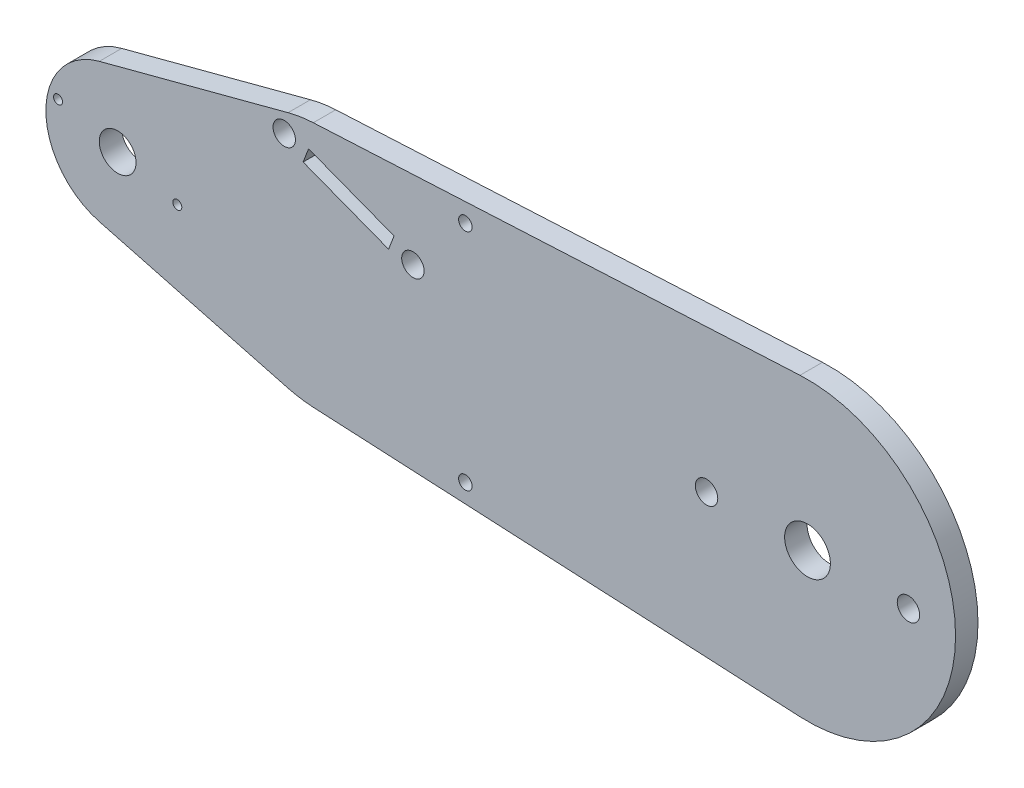
ISO-10303-21;
HEADER;
FILE_DESCRIPTION(('STEP AP214'),'2;1');
FILE_NAME('part.step','',(''),(''),'','','');
FILE_SCHEMA(('AUTOMOTIVE_DESIGN { 1 0 10303 214 1 1 1 1 }'));
ENDSEC;
DATA;
#1=APPLICATION_CONTEXT('core data for automotive mechanical design processes');
#2=APPLICATION_PROTOCOL_DEFINITION('international standard','automotive_design',2000,#1);
#3=PRODUCT_CONTEXT('',#1,'mechanical');
#4=PRODUCT('Part','Part','',(#3));
#5=PRODUCT_RELATED_PRODUCT_CATEGORY('part','',(#4));
#6=PRODUCT_DEFINITION_FORMATION('','',#4);
#7=PRODUCT_DEFINITION_CONTEXT('part definition',#1,'design');
#8=PRODUCT_DEFINITION('design','',#6,#7);
#9=PRODUCT_DEFINITION_SHAPE('','',#8);
#10=(LENGTH_UNIT() NAMED_UNIT(*) SI_UNIT(.MILLI.,.METRE.));
#11=(NAMED_UNIT(*) PLANE_ANGLE_UNIT() SI_UNIT($,.RADIAN.));
#12=(NAMED_UNIT(*) SI_UNIT($,.STERADIAN.) SOLID_ANGLE_UNIT());
#13=UNCERTAINTY_MEASURE_WITH_UNIT(LENGTH_MEASURE(1.E-05),#10,'distance_accuracy_value','');
#14=(GEOMETRIC_REPRESENTATION_CONTEXT(3) GLOBAL_UNCERTAINTY_ASSIGNED_CONTEXT((#13)) GLOBAL_UNIT_ASSIGNED_CONTEXT((#10,
#11,#12)) REPRESENTATION_CONTEXT('',''));
#15=CARTESIAN_POINT('',(0.,0.,0.));
#16=DIRECTION('',(0.,0.,1.));
#17=DIRECTION('',(1.,0.,0.));
#18=AXIS2_PLACEMENT_3D('',#15,#16,#17);
#19=CARTESIAN_POINT('',(0.,0.,5.));
#20=DIRECTION('',(0.,0.,1.));
#21=DIRECTION('',(1.,0.,0.));
#22=AXIS2_PLACEMENT_3D('',#19,#20,#21);
#23=PLANE('',#22);
#24=CARTESIAN_POINT('',(-88.5815773829106,-3.51388888888885,5.));
#25=DIRECTION('',(0.,0.,1.));
#26=DIRECTION('',(1.,0.,0.));
#27=AXIS2_PLACEMENT_3D('',#24,#25,#26);
#28=CIRCLE('',#27,0.999999999999998);
#29=CARTESIAN_POINT('',(-87.5815773829106,-3.51388888888885,5.));
#30=VERTEX_POINT('',#29);
#31=EDGE_CURVE('E265',#30,#30,#28,.T.);
#32=ORIENTED_EDGE('',*,*,#31,.F.);
#33=EDGE_LOOP('',(#32));
#34=FACE_BOUND('',#33,.T.);
#35=CARTESIAN_POINT('',(-115.168422617089,3.51388888888893,5.));
#36=DIRECTION('',(0.,0.,1.));
#37=DIRECTION('',(-1.,0.,0.));
#38=AXIS2_PLACEMENT_3D('',#35,#36,#37);
#39=CIRCLE('',#38,0.999999999999998);
#40=CARTESIAN_POINT('',(-116.168422617089,3.51388888888893,5.));
#41=VERTEX_POINT('',#40);
#42=EDGE_CURVE('E269',#41,#41,#39,.T.);
#43=ORIENTED_EDGE('',*,*,#42,.F.);
#44=EDGE_LOOP('',(#43));
#45=FACE_BOUND('',#44,.T.);
#46=DIRECTION('',(-0.358042046673402,-0.933705463630754,0.));
#47=VECTOR('',#46,1.);
#48=CARTESIAN_POINT('',(-59.0423704408644,22.6405991787751,5.));
#49=LINE('',#48,#47);
#50=CARTESIAN_POINT('',(-59.3204932961019,21.9153077446862,5.));
#51=VERTEX_POINT('',#50);
#52=CARTESIAN_POINT('',(-60.5378362547915,18.7407091683417,5.));
#53=VERTEX_POINT('',#52);
#54=EDGE_CURVE('E135',#51,#53,#49,.T.);
#55=ORIENTED_EDGE('',*,*,#54,.F.);
#56=DIRECTION('',(-0.933705463630753,0.358042046673404,0.));
#57=VECTOR('',#56,1.);
#58=CARTESIAN_POINT('',(-0.278122855237568,-0.725291434088967,5.));
#59=LINE('',#58,#57);
#60=CARTESIAN_POINT('',(-40.2729018380345,14.6112499925488,5.));
#61=VERTEX_POINT('',#60);
#62=EDGE_CURVE('E174',#61,#51,#59,.T.);
#63=ORIENTED_EDGE('',*,*,#62,.F.);
#64=DIRECTION('',(0.358042046673404,0.933705463630753,0.));
#65=VECTOR('',#64,1.);
#66=CARTESIAN_POINT('',(-39.994778982797,15.3365414266378,5.));
#67=LINE('',#66,#65);
#68=CARTESIAN_POINT('',(-41.4902447967241,11.4366514162042,5.));
#69=VERTEX_POINT('',#68);
#70=EDGE_CURVE('E172',#69,#61,#67,.T.);
#71=ORIENTED_EDGE('',*,*,#70,.F.);
#72=DIRECTION('',(0.933705463630753,-0.358042046673404,0.));
#73=VECTOR('',#72,1.);
#74=CARTESIAN_POINT('',(-1.49546581392714,-3.89989001043353,5.));
#75=LINE('',#74,#73);
#76=EDGE_CURVE('E170',#53,#69,#75,.T.);
#77=ORIENTED_EDGE('',*,*,#76,.F.);
#78=EDGE_LOOP('',(#55,#63,#71,#77));
#79=FACE_BOUND('',#78,.T.);
#80=CARTESIAN_POINT('',(-64.7424236827205,22.1737179842573,5.));
#81=DIRECTION('',(0.,0.,1.));
#82=DIRECTION('',(1.,0.,0.));
#83=AXIS2_PLACEMENT_3D('',#80,#81,#82);
#84=CIRCLE('',#83,2.5);
#85=CARTESIAN_POINT('',(-62.2424236827205,22.1737179842573,5.));
#86=VERTEX_POINT('',#85);
#87=EDGE_CURVE('E163',#86,#86,#84,.T.);
#88=ORIENTED_EDGE('',*,*,#87,.F.);
#89=EDGE_LOOP('',(#88));
#90=FACE_BOUND('',#89,.T.);
#91=CARTESIAN_POINT('',(-36.0683144101055,11.1782411766331,5.));
#92=DIRECTION('',(0.,0.,1.));
#93=DIRECTION('',(1.,0.,0.));
#94=AXIS2_PLACEMENT_3D('',#91,#92,#93);
#95=CIRCLE('',#94,2.5);
#96=CARTESIAN_POINT('',(-33.5683144101055,11.1782411766331,5.));
#97=VERTEX_POINT('',#96);
#98=EDGE_CURVE('E166',#97,#97,#95,.T.);
#99=ORIENTED_EDGE('',*,*,#98,.F.);
#100=EDGE_LOOP('',(#99));
#101=FACE_BOUND('',#100,.T.);
#102=CARTESIAN_POINT('',(-24.375,-25.,5.));
#103=DIRECTION('',(0.,0.,-1.));
#104=DIRECTION('',(1.,0.,0.));
#105=AXIS2_PLACEMENT_3D('',#102,#103,#104);
#106=CIRCLE('',#105,1.5);
#107=CARTESIAN_POINT('',(-22.875,-25.,5.));
#108=VERTEX_POINT('',#107);
#109=EDGE_CURVE('E177',#108,#108,#106,.T.);
#110=ORIENTED_EDGE('',*,*,#109,.T.);
#111=EDGE_LOOP('',(#110));
#112=FACE_BOUND('',#111,.T.);
#113=CARTESIAN_POINT('',(-101.875,0.,5.));
#114=DIRECTION('',(0.,0.,1.));
#115=DIRECTION('',(1.,0.,0.));
#116=AXIS2_PLACEMENT_3D('',#113,#114,#115);
#117=CIRCLE('',#116,4.09999999999999);
#118=CARTESIAN_POINT('',(-97.775,0.,5.));
#119=VERTEX_POINT('',#118);
#120=EDGE_CURVE('E213',#119,#119,#117,.T.);
#121=ORIENTED_EDGE('',*,*,#120,.F.);
#122=EDGE_LOOP('',(#121));
#123=FACE_BOUND('',#122,.T.);
#124=CARTESIAN_POINT('',(51.875,0.,5.));
#125=DIRECTION('',(0.,0.,1.));
#126=DIRECTION('',(1.,0.,0.));
#127=AXIS2_PLACEMENT_3D('',#124,#125,#126);
#128=CIRCLE('',#127,5.1);
#129=CARTESIAN_POINT('',(56.975,0.,5.));
#130=VERTEX_POINT('',#129);
#131=EDGE_CURVE('E210',#130,#130,#128,.T.);
#132=ORIENTED_EDGE('',*,*,#131,.F.);
#133=EDGE_LOOP('',(#132));
#134=FACE_BOUND('',#133,.T.);
#135=DIRECTION('',(0.966794372151954,0.255555555555556,0.));
#136=VECTOR('',#135,1.);
#137=CARTESIAN_POINT('',(-10.7422067901235,40.6389328794152,5.));
#138=LINE('',#137,#136);
#139=CARTESIAN_POINT('',(-105.963888888889,15.4687099544313,5.));
#140=VERTEX_POINT('',#139);
#141=CARTESIAN_POINT('',(-63.9027777777778,26.5868452341787,5.));
#142=VERTEX_POINT('',#141);
#143=EDGE_CURVE('E192',#140,#142,#138,.T.);
#144=ORIENTED_EDGE('',*,*,#143,.F.);
#145=CARTESIAN_POINT('',(-101.875,0.,5.));
#146=DIRECTION('',(0.,0.,1.));
#147=DIRECTION('',(1.,0.,0.));
#148=AXIS2_PLACEMENT_3D('',#145,#146,#147);
#149=CIRCLE('',#148,16.);
#150=CARTESIAN_POINT('',(-105.963888888889,-15.4687099544313,5.));
#151=VERTEX_POINT('',#150);
#152=EDGE_CURVE('E195',#140,#151,#149,.T.);
#153=ORIENTED_EDGE('',*,*,#152,.T.);
#154=DIRECTION('',(0.966794372151954,-0.255555555555555,0.));
#155=VECTOR('',#154,1.);
#156=CARTESIAN_POINT('',(-10.7422067901235,-40.6389328794151,5.));
#157=LINE('',#156,#155);
#158=CARTESIAN_POINT('',(-63.9027777777778,-26.5868452341787,5.));
#159=VERTEX_POINT('',#158);
#160=EDGE_CURVE('E198',#151,#159,#157,.T.);
#161=ORIENTED_EDGE('',*,*,#160,.T.);
#162=CARTESIAN_POINT('',(-56.875,0.,5.));
#163=DIRECTION('',(0.,0.,1.));
#164=DIRECTION('',(1.,0.,0.));
#165=AXIS2_PLACEMENT_3D('',#162,#163,#164);
#166=CIRCLE('',#165,27.5);
#167=CARTESIAN_POINT('',(-58.2658045977012,-27.4648077104322,5.));
#168=VERTEX_POINT('',#167);
#169=EDGE_CURVE('E200',#159,#168,#166,.T.);
#170=ORIENTED_EDGE('',*,*,#169,.T.);
#171=DIRECTION('',(0.998720280379351,-0.0505747126436782,0.));
#172=VECTOR('',#171,1.);
#173=CARTESIAN_POINT('',(-1.53627956136874,-30.3375634594544,5.));
#174=LINE('',#173,#172);
#175=CARTESIAN_POINT('',(50.2060344827586,-32.9577692525186,5.));
#176=VERTEX_POINT('',#175);
#177=EDGE_CURVE('E202',#168,#176,#174,.T.);
#178=ORIENTED_EDGE('',*,*,#177,.T.);
#179=CARTESIAN_POINT('',(51.875,0.,5.));
#180=DIRECTION('',(0.,0.,1.));
#181=DIRECTION('',(1.,0.,0.));
#182=AXIS2_PLACEMENT_3D('',#179,#180,#181);
#183=CIRCLE('',#182,33.);
#184=CARTESIAN_POINT('',(50.2060344827586,32.9577692525186,5.));
#185=VERTEX_POINT('',#184);
#186=EDGE_CURVE('E205',#176,#185,#183,.T.);
#187=ORIENTED_EDGE('',*,*,#186,.T.);
#188=DIRECTION('',(0.998720280379351,0.0505747126436782,0.));
#189=VECTOR('',#188,1.);
#190=CARTESIAN_POINT('',(-1.53627956136874,30.3375634594544,5.));
#191=LINE('',#190,#189);
#192=CARTESIAN_POINT('',(-58.2658045977012,27.4648077104322,5.));
#193=VERTEX_POINT('',#192);
#194=EDGE_CURVE('E207',#193,#185,#191,.T.);
#195=ORIENTED_EDGE('',*,*,#194,.F.);
#196=EDGE_CURVE('E203',#193,#142,#166,.T.);
#197=ORIENTED_EDGE('',*,*,#196,.T.);
#198=EDGE_LOOP('',(#144,#153,#161,#170,#178,#187,#195,#197));
#199=FACE_BOUND('',#198,.T.);
#200=CARTESIAN_POINT('',(74.375,0.,5.));
#201=DIRECTION('',(0.,0.,1.));
#202=DIRECTION('',(-1.,0.,0.));
#203=AXIS2_PLACEMENT_3D('',#200,#201,#202);
#204=CIRCLE('',#203,2.5);
#205=CARTESIAN_POINT('',(71.875,0.,5.));
#206=VERTEX_POINT('',#205);
#207=EDGE_CURVE('E189',#206,#206,#204,.T.);
#208=ORIENTED_EDGE('',*,*,#207,.F.);
#209=EDGE_LOOP('',(#208));
#210=FACE_BOUND('',#209,.T.);
#211=CARTESIAN_POINT('',(29.375,0.,5.));
#212=DIRECTION('',(0.,0.,1.));
#213=DIRECTION('',(1.,0.,0.));
#214=AXIS2_PLACEMENT_3D('',#211,#212,#213);
#215=CIRCLE('',#214,2.5);
#216=CARTESIAN_POINT('',(31.875,0.,5.));
#217=VERTEX_POINT('',#216);
#218=EDGE_CURVE('E185',#217,#217,#215,.T.);
#219=ORIENTED_EDGE('',*,*,#218,.F.);
#220=EDGE_LOOP('',(#219));
#221=FACE_BOUND('',#220,.T.);
#222=CARTESIAN_POINT('',(-24.375,25.,5.));
#223=DIRECTION('',(0.,0.,1.));
#224=DIRECTION('',(1.,0.,0.));
#225=AXIS2_PLACEMENT_3D('',#222,#223,#224);
#226=CIRCLE('',#225,1.5);
#227=CARTESIAN_POINT('',(-22.875,25.,5.));
#228=VERTEX_POINT('',#227);
#229=EDGE_CURVE('E181',#228,#228,#226,.T.);
#230=ORIENTED_EDGE('',*,*,#229,.F.);
#231=EDGE_LOOP('',(#230));
#232=FACE_BOUND('',#231,.T.);
#233=ADVANCED_FACE('F39',(#34,#45,#79,#90,#101,#112,#123,#134,#199,#210,#221,#232),#23,.T.);
#234=CARTESIAN_POINT('',(-10.7422067901235,40.6389328794152,5.));
#235=DIRECTION('',(-0.255555555555556,0.966794372151954,0.));
#236=DIRECTION('',(-0.966794372151954,-0.255555555555556,0.));
#237=AXIS2_PLACEMENT_3D('',#234,#235,#236);
#238=PLANE('',#237);
#239=DIRECTION('',(0.966794372151954,0.255555555555556,0.));
#240=VECTOR('',#239,1.);
#241=CARTESIAN_POINT('',(-10.7422067901235,40.6389328794152,0.));
#242=LINE('',#241,#240);
#243=CARTESIAN_POINT('',(-105.963888888889,15.4687099544313,0.));
#244=VERTEX_POINT('',#243);
#245=CARTESIAN_POINT('',(-63.9027777777778,26.5868452341787,0.));
#246=VERTEX_POINT('',#245);
#247=EDGE_CURVE('E217',#244,#246,#242,.T.);
#248=ORIENTED_EDGE('',*,*,#247,.F.);
#249=DIRECTION('',(0.,0.,-1.));
#250=VECTOR('',#249,1.);
#251=CARTESIAN_POINT('',(-105.963888888889,15.4687099544313,5.));
#252=LINE('',#251,#250);
#253=EDGE_CURVE('E11',#140,#244,#252,.T.);
#254=ORIENTED_EDGE('',*,*,#253,.F.);
#255=ORIENTED_EDGE('',*,*,#143,.T.);
#256=DIRECTION('',(0.,0.,-1.));
#257=VECTOR('',#256,1.);
#258=CARTESIAN_POINT('',(-63.9027777777778,26.5868452341787,5.));
#259=LINE('',#258,#257);
#260=EDGE_CURVE('E216',#142,#246,#259,.T.);
#261=ORIENTED_EDGE('',*,*,#260,.T.);
#262=EDGE_LOOP('',(#248,#254,#255,#261));
#263=FACE_BOUND('',#262,.T.);
#264=ADVANCED_FACE('F41',(#263),#238,.T.);
#265=CARTESIAN_POINT('',(-101.875,0.,5.));
#266=DIRECTION('',(0.,0.,-1.));
#267=DIRECTION('',(-1.,0.,0.));
#268=AXIS2_PLACEMENT_3D('',#265,#266,#267);
#269=CYLINDRICAL_SURFACE('',#268,16.);
#270=CARTESIAN_POINT('',(-101.875,0.,0.));
#271=DIRECTION('',(0.,0.,1.));
#272=DIRECTION('',(1.,0.,0.));
#273=AXIS2_PLACEMENT_3D('',#270,#271,#272);
#274=CIRCLE('',#273,16.);
#275=CARTESIAN_POINT('',(-105.963888888889,-15.4687099544313,0.));
#276=VERTEX_POINT('',#275);
#277=EDGE_CURVE('E220',#244,#276,#274,.T.);
#278=ORIENTED_EDGE('',*,*,#277,.T.);
#279=DIRECTION('',(0.,0.,-1.));
#280=VECTOR('',#279,1.);
#281=CARTESIAN_POINT('',(-105.963888888889,-15.4687099544313,5.));
#282=LINE('',#281,#280);
#283=EDGE_CURVE('E48',#151,#276,#282,.T.);
#284=ORIENTED_EDGE('',*,*,#283,.F.);
#285=ORIENTED_EDGE('',*,*,#152,.F.);
#286=ORIENTED_EDGE('',*,*,#253,.T.);
#287=EDGE_LOOP('',(#278,#284,#285,#286));
#288=FACE_BOUND('',#287,.T.);
#289=ADVANCED_FACE('F303',(#288),#269,.T.);
#290=CARTESIAN_POINT('',(-10.7422067901235,-40.6389328794151,5.));
#291=DIRECTION('',(0.255555555555555,0.966794372151954,0.));
#292=DIRECTION('',(-0.966794372151954,0.255555555555555,0.));
#293=AXIS2_PLACEMENT_3D('',#290,#291,#292);
#294=PLANE('',#293);
#295=DIRECTION('',(0.966794372151954,-0.255555555555555,0.));
#296=VECTOR('',#295,1.);
#297=CARTESIAN_POINT('',(-10.7422067901235,-40.6389328794151,0.));
#298=LINE('',#297,#296);
#299=CARTESIAN_POINT('',(-63.9027777777778,-26.5868452341787,0.));
#300=VERTEX_POINT('',#299);
#301=EDGE_CURVE('E223',#276,#300,#298,.T.);
#302=ORIENTED_EDGE('',*,*,#301,.T.);
#303=DIRECTION('',(0.,0.,-1.));
#304=VECTOR('',#303,1.);
#305=CARTESIAN_POINT('',(-63.9027777777778,-26.5868452341787,5.));
#306=LINE('',#305,#304);
#307=EDGE_CURVE('E252',#159,#300,#306,.T.);
#308=ORIENTED_EDGE('',*,*,#307,.F.);
#309=ORIENTED_EDGE('',*,*,#160,.F.);
#310=ORIENTED_EDGE('',*,*,#283,.T.);
#311=EDGE_LOOP('',(#302,#308,#309,#310));
#312=FACE_BOUND('',#311,.T.);
#313=ADVANCED_FACE('F340',(#312),#294,.F.);
#314=CARTESIAN_POINT('',(-56.875,0.,5.));
#315=DIRECTION('',(0.,0.,-1.));
#316=DIRECTION('',(-1.,0.,0.));
#317=AXIS2_PLACEMENT_3D('',#314,#315,#316);
#318=CYLINDRICAL_SURFACE('',#317,27.5);
#319=CARTESIAN_POINT('',(-56.875,0.,0.));
#320=DIRECTION('',(0.,0.,1.));
#321=DIRECTION('',(1.,0.,0.));
#322=AXIS2_PLACEMENT_3D('',#319,#320,#321);
#323=CIRCLE('',#322,27.5);
#324=CARTESIAN_POINT('',(-58.2658045977012,-27.4648077104322,0.));
#325=VERTEX_POINT('',#324);
#326=EDGE_CURVE('E225',#300,#325,#323,.T.);
#327=ORIENTED_EDGE('',*,*,#326,.T.);
#328=DIRECTION('',(0.,0.,-1.));
#329=VECTOR('',#328,1.);
#330=CARTESIAN_POINT('',(-58.2658045977012,-27.4648077104322,5.));
#331=LINE('',#330,#329);
#332=EDGE_CURVE('E249',#168,#325,#331,.T.);
#333=ORIENTED_EDGE('',*,*,#332,.F.);
#334=ORIENTED_EDGE('',*,*,#169,.F.);
#335=ORIENTED_EDGE('',*,*,#307,.T.);
#336=EDGE_LOOP('',(#327,#333,#334,#335));
#337=FACE_BOUND('',#336,.T.);
#338=ADVANCED_FACE('F328',(#337),#318,.T.);
#339=CARTESIAN_POINT('',(-1.53627956136874,-30.3375634594544,5.));
#340=DIRECTION('',(0.0505747126436782,0.998720280379351,0.));
#341=DIRECTION('',(-0.998720280379351,0.0505747126436782,0.));
#342=AXIS2_PLACEMENT_3D('',#339,#340,#341);
#343=PLANE('',#342);
#344=DIRECTION('',(0.998720280379351,-0.0505747126436782,0.));
#345=VECTOR('',#344,1.);
#346=CARTESIAN_POINT('',(-1.53627956136874,-30.3375634594544,0.));
#347=LINE('',#346,#345);
#348=CARTESIAN_POINT('',(50.2060344827586,-32.9577692525186,0.));
#349=VERTEX_POINT('',#348);
#350=EDGE_CURVE('E227',#325,#349,#347,.T.);
#351=ORIENTED_EDGE('',*,*,#350,.T.);
#352=DIRECTION('',(0.,0.,-1.));
#353=VECTOR('',#352,1.);
#354=CARTESIAN_POINT('',(50.2060344827586,-32.9577692525186,5.));
#355=LINE('',#354,#353);
#356=EDGE_CURVE('E246',#176,#349,#355,.T.);
#357=ORIENTED_EDGE('',*,*,#356,.F.);
#358=ORIENTED_EDGE('',*,*,#177,.F.);
#359=ORIENTED_EDGE('',*,*,#332,.T.);
#360=EDGE_LOOP('',(#351,#357,#358,#359));
#361=FACE_BOUND('',#360,.T.);
#362=ADVANCED_FACE('F335',(#361),#343,.F.);
#363=CARTESIAN_POINT('',(51.875,0.,5.));
#364=DIRECTION('',(0.,0.,-1.));
#365=DIRECTION('',(-1.,0.,0.));
#366=AXIS2_PLACEMENT_3D('',#363,#364,#365);
#367=CYLINDRICAL_SURFACE('',#366,33.);
#368=CARTESIAN_POINT('',(51.875,0.,0.));
#369=DIRECTION('',(0.,0.,1.));
#370=DIRECTION('',(1.,0.,0.));
#371=AXIS2_PLACEMENT_3D('',#368,#369,#370);
#372=CIRCLE('',#371,33.);
#373=CARTESIAN_POINT('',(50.2060344827586,32.9577692525186,0.));
#374=VERTEX_POINT('',#373);
#375=EDGE_CURVE('E230',#349,#374,#372,.T.);
#376=ORIENTED_EDGE('',*,*,#375,.T.);
#377=DIRECTION('',(0.,0.,-1.));
#378=VECTOR('',#377,1.);
#379=CARTESIAN_POINT('',(50.2060344827586,32.9577692525186,5.));
#380=LINE('',#379,#378);
#381=EDGE_CURVE('E244',#185,#374,#380,.T.);
#382=ORIENTED_EDGE('',*,*,#381,.F.);
#383=ORIENTED_EDGE('',*,*,#186,.F.);
#384=ORIENTED_EDGE('',*,*,#356,.T.);
#385=EDGE_LOOP('',(#376,#382,#383,#384));
#386=FACE_BOUND('',#385,.T.);
#387=ADVANCED_FACE('F331',(#386),#367,.T.);
#388=CARTESIAN_POINT('',(-1.53627956136874,30.3375634594544,5.));
#389=DIRECTION('',(-0.0505747126436782,0.998720280379351,0.));
#390=DIRECTION('',(-0.998720280379351,-0.0505747126436782,0.));
#391=AXIS2_PLACEMENT_3D('',#388,#389,#390);
#392=PLANE('',#391);
#393=DIRECTION('',(0.998720280379351,0.0505747126436782,0.));
#394=VECTOR('',#393,1.);
#395=CARTESIAN_POINT('',(-1.53627956136874,30.3375634594544,0.));
#396=LINE('',#395,#394);
#397=CARTESIAN_POINT('',(-58.2658045977012,27.4648077104322,0.));
#398=VERTEX_POINT('',#397);
#399=EDGE_CURVE('E233',#398,#374,#396,.T.);
#400=ORIENTED_EDGE('',*,*,#399,.F.);
#401=DIRECTION('',(0.,0.,-1.));
#402=VECTOR('',#401,1.);
#403=CARTESIAN_POINT('',(-58.2658045977012,27.4648077104322,5.));
#404=LINE('',#403,#402);
#405=EDGE_CURVE('E242',#193,#398,#404,.T.);
#406=ORIENTED_EDGE('',*,*,#405,.F.);
#407=ORIENTED_EDGE('',*,*,#194,.T.);
#408=ORIENTED_EDGE('',*,*,#381,.T.);
#409=EDGE_LOOP('',(#400,#406,#407,#408));
#410=FACE_BOUND('',#409,.T.);
#411=ADVANCED_FACE('F323',(#410),#392,.T.);
#412=CARTESIAN_POINT('',(51.875,0.,5.));
#413=DIRECTION('',(0.,0.,-1.));
#414=DIRECTION('',(-1.,0.,0.));
#415=AXIS2_PLACEMENT_3D('',#412,#413,#414);
#416=CYLINDRICAL_SURFACE('',#415,5.1);
#417=ORIENTED_EDGE('',*,*,#131,.T.);
#418=EDGE_LOOP('',(#417));
#419=FACE_BOUND('',#418,.T.);
#420=CARTESIAN_POINT('',(51.875,0.,0.));
#421=DIRECTION('',(0.,0.,1.));
#422=DIRECTION('',(1.,0.,0.));
#423=AXIS2_PLACEMENT_3D('',#420,#421,#422);
#424=CIRCLE('',#423,5.1);
#425=CARTESIAN_POINT('',(56.975,0.,0.));
#426=VERTEX_POINT('',#425);
#427=EDGE_CURVE('E236',#426,#426,#424,.T.);
#428=ORIENTED_EDGE('',*,*,#427,.F.);
#429=EDGE_LOOP('',(#428));
#430=FACE_BOUND('',#429,.T.);
#431=ADVANCED_FACE('F320',(#419,#430),#416,.F.);
#432=EDGE_CURVE('E228',#398,#246,#323,.T.);
#433=ORIENTED_EDGE('',*,*,#432,.T.);
#434=ORIENTED_EDGE('',*,*,#260,.F.);
#435=ORIENTED_EDGE('',*,*,#196,.F.);
#436=ORIENTED_EDGE('',*,*,#405,.T.);
#437=EDGE_LOOP('',(#433,#434,#435,#436));
#438=FACE_BOUND('',#437,.T.);
#439=ADVANCED_FACE('F318',(#438),#318,.T.);
#440=CARTESIAN_POINT('',(-101.875,0.,5.));
#441=DIRECTION('',(0.,0.,-1.));
#442=DIRECTION('',(-1.,0.,0.));
#443=AXIS2_PLACEMENT_3D('',#440,#441,#442);
#444=CYLINDRICAL_SURFACE('',#443,4.09999999999999);
#445=ORIENTED_EDGE('',*,*,#120,.T.);
#446=EDGE_LOOP('',(#445));
#447=FACE_BOUND('',#446,.T.);
#448=CARTESIAN_POINT('',(-101.875,0.,0.));
#449=DIRECTION('',(0.,0.,1.));
#450=DIRECTION('',(1.,0.,0.));
#451=AXIS2_PLACEMENT_3D('',#448,#449,#450);
#452=CIRCLE('',#451,4.09999999999999);
#453=CARTESIAN_POINT('',(-97.775,0.,0.));
#454=VERTEX_POINT('',#453);
#455=EDGE_CURVE('E196',#454,#454,#452,.T.);
#456=ORIENTED_EDGE('',*,*,#455,.F.);
#457=EDGE_LOOP('',(#456));
#458=FACE_BOUND('',#457,.T.);
#459=ADVANCED_FACE('F315',(#447,#458),#444,.F.);
#460=CARTESIAN_POINT('',(74.375,0.,-2.));
#461=DIRECTION('',(0.,0.,1.));
#462=DIRECTION('',(1.,0.,0.));
#463=AXIS2_PLACEMENT_3D('',#460,#461,#462);
#464=CYLINDRICAL_SURFACE('',#463,2.5);
#465=ORIENTED_EDGE('',*,*,#207,.T.);
#466=EDGE_LOOP('',(#465));
#467=FACE_BOUND('',#466,.T.);
#468=CARTESIAN_POINT('',(74.375,0.,0.));
#469=DIRECTION('',(0.,0.,1.));
#470=DIRECTION('',(1.,0.,0.));
#471=AXIS2_PLACEMENT_3D('',#468,#469,#470);
#472=CIRCLE('',#471,2.5);
#473=CARTESIAN_POINT('',(76.875,0.,0.));
#474=VERTEX_POINT('',#473);
#475=EDGE_CURVE('E188',#474,#474,#472,.T.);
#476=ORIENTED_EDGE('',*,*,#475,.F.);
#477=EDGE_LOOP('',(#476));
#478=FACE_BOUND('',#477,.T.);
#479=ADVANCED_FACE('F308',(#467,#478),#464,.F.);
#480=CARTESIAN_POINT('',(29.375,0.,-2.));
#481=DIRECTION('',(0.,0.,1.));
#482=DIRECTION('',(1.,0.,0.));
#483=AXIS2_PLACEMENT_3D('',#480,#481,#482);
#484=CYLINDRICAL_SURFACE('',#483,2.5);
#485=ORIENTED_EDGE('',*,*,#218,.T.);
#486=EDGE_LOOP('',(#485));
#487=FACE_BOUND('',#486,.T.);
#488=CARTESIAN_POINT('',(29.375,0.,0.));
#489=DIRECTION('',(0.,0.,1.));
#490=DIRECTION('',(1.,0.,0.));
#491=AXIS2_PLACEMENT_3D('',#488,#489,#490);
#492=CIRCLE('',#491,2.5);
#493=CARTESIAN_POINT('',(31.875,0.,0.));
#494=VERTEX_POINT('',#493);
#495=EDGE_CURVE('E221',#494,#494,#492,.T.);
#496=ORIENTED_EDGE('',*,*,#495,.F.);
#497=EDGE_LOOP('',(#496));
#498=FACE_BOUND('',#497,.T.);
#499=ADVANCED_FACE('F383',(#487,#498),#484,.F.);
#500=CARTESIAN_POINT('',(-24.375,25.,-1.));
#501=DIRECTION('',(0.,0.,1.));
#502=DIRECTION('',(1.,0.,0.));
#503=AXIS2_PLACEMENT_3D('',#500,#501,#502);
#504=CYLINDRICAL_SURFACE('',#503,1.5);
#505=ORIENTED_EDGE('',*,*,#229,.T.);
#506=EDGE_LOOP('',(#505));
#507=FACE_BOUND('',#506,.T.);
#508=CARTESIAN_POINT('',(-24.375,25.,0.));
#509=DIRECTION('',(0.,0.,1.));
#510=DIRECTION('',(1.,0.,0.));
#511=AXIS2_PLACEMENT_3D('',#508,#509,#510);
#512=CIRCLE('',#511,1.5);
#513=CARTESIAN_POINT('',(-22.875,25.,0.));
#514=VERTEX_POINT('',#513);
#515=EDGE_CURVE('E184',#514,#514,#512,.T.);
#516=ORIENTED_EDGE('',*,*,#515,.F.);
#517=EDGE_LOOP('',(#516));
#518=FACE_BOUND('',#517,.T.);
#519=ADVANCED_FACE('F313',(#507,#518),#504,.F.);
#520=CARTESIAN_POINT('',(0.,0.,0.));
#521=DIRECTION('',(0.,0.,1.));
#522=DIRECTION('',(1.,0.,0.));
#523=AXIS2_PLACEMENT_3D('',#520,#521,#522);
#524=PLANE('',#523);
#525=CARTESIAN_POINT('',(-24.375,-25.,0.));
#526=DIRECTION('',(0.,0.,1.));
#527=DIRECTION('',(1.,0.,0.));
#528=AXIS2_PLACEMENT_3D('',#525,#526,#527);
#529=CIRCLE('',#528,1.5);
#530=CARTESIAN_POINT('',(-22.875,-25.,0.));
#531=VERTEX_POINT('',#530);
#532=EDGE_CURVE('E180',#531,#531,#529,.F.);
#533=ORIENTED_EDGE('',*,*,#532,.F.);
#534=EDGE_LOOP('',(#533));
#535=FACE_BOUND('',#534,.T.);
#536=CARTESIAN_POINT('',(-88.5815773829106,-3.51388888888885,0.));
#537=DIRECTION('',(0.,0.,1.));
#538=DIRECTION('',(1.,0.,0.));
#539=AXIS2_PLACEMENT_3D('',#536,#537,#538);
#540=CIRCLE('',#539,0.999999999999998);
#541=CARTESIAN_POINT('',(-87.5815773829106,-3.51388888888885,0.));
#542=VERTEX_POINT('',#541);
#543=EDGE_CURVE('E43',#542,#542,#540,.T.);
#544=ORIENTED_EDGE('',*,*,#543,.T.);
#545=EDGE_LOOP('',(#544));
#546=FACE_BOUND('',#545,.T.);
#547=CARTESIAN_POINT('',(-115.168422617089,3.51388888888893,0.));
#548=DIRECTION('',(0.,0.,1.));
#549=DIRECTION('',(1.,0.,0.));
#550=AXIS2_PLACEMENT_3D('',#547,#548,#549);
#551=CIRCLE('',#550,0.999999999999998);
#552=CARTESIAN_POINT('',(-114.168422617089,3.51388888888893,0.));
#553=VERTEX_POINT('',#552);
#554=EDGE_CURVE('E150',#553,#553,#551,.T.);
#555=ORIENTED_EDGE('',*,*,#554,.T.);
#556=EDGE_LOOP('',(#555));
#557=FACE_BOUND('',#556,.T.);
#558=CARTESIAN_POINT('',(-36.0683144101055,11.1782411766331,0.));
#559=DIRECTION('',(0.,0.,1.));
#560=DIRECTION('',(1.,0.,0.));
#561=AXIS2_PLACEMENT_3D('',#558,#559,#560);
#562=CIRCLE('',#561,2.5);
#563=CARTESIAN_POINT('',(-33.5683144101055,11.1782411766331,0.));
#564=VERTEX_POINT('',#563);
#565=EDGE_CURVE('E167',#564,#564,#562,.T.);
#566=ORIENTED_EDGE('',*,*,#565,.T.);
#567=EDGE_LOOP('',(#566));
#568=FACE_BOUND('',#567,.T.);
#569=CARTESIAN_POINT('',(-64.7424236827205,22.1737179842573,0.));
#570=DIRECTION('',(0.,0.,1.));
#571=DIRECTION('',(1.,0.,0.));
#572=AXIS2_PLACEMENT_3D('',#569,#570,#571);
#573=CIRCLE('',#572,2.5);
#574=CARTESIAN_POINT('',(-62.2424236827205,22.1737179842573,0.));
#575=VERTEX_POINT('',#574);
#576=EDGE_CURVE('E152',#575,#575,#573,.T.);
#577=ORIENTED_EDGE('',*,*,#576,.T.);
#578=EDGE_LOOP('',(#577));
#579=FACE_BOUND('',#578,.T.);
#580=DIRECTION('',(-0.933705463630753,0.358042046673404,0.));
#581=VECTOR('',#580,1.);
#582=CARTESIAN_POINT('',(-59.3204932961019,21.9153077446862,0.));
#583=LINE('',#582,#581);
#584=CARTESIAN_POINT('',(-40.2729018380345,14.6112499925488,0.));
#585=VERTEX_POINT('',#584);
#586=CARTESIAN_POINT('',(-59.3204932961019,21.9153077446862,0.));
#587=VERTEX_POINT('',#586);
#588=EDGE_CURVE('E138',#585,#587,#583,.T.);
#589=ORIENTED_EDGE('',*,*,#588,.T.);
#590=DIRECTION('',(-0.358042046673402,-0.933705463630754,0.));
#591=VECTOR('',#590,1.);
#592=CARTESIAN_POINT('',(-60.5378362547915,18.7407091683417,0.));
#593=LINE('',#592,#591);
#594=CARTESIAN_POINT('',(-60.5378362547915,18.7407091683417,0.));
#595=VERTEX_POINT('',#594);
#596=EDGE_CURVE('E132',#587,#595,#593,.T.);
#597=ORIENTED_EDGE('',*,*,#596,.T.);
#598=DIRECTION('',(0.933705463630753,-0.358042046673404,0.));
#599=VECTOR('',#598,1.);
#600=CARTESIAN_POINT('',(-41.4902447967241,11.4366514162042,0.));
#601=LINE('',#600,#599);
#602=CARTESIAN_POINT('',(-41.4902447967241,11.4366514162042,0.));
#603=VERTEX_POINT('',#602);
#604=EDGE_CURVE('E141',#595,#603,#601,.T.);
#605=ORIENTED_EDGE('',*,*,#604,.T.);
#606=DIRECTION('',(0.358042046673404,0.933705463630753,0.));
#607=VECTOR('',#606,1.);
#608=CARTESIAN_POINT('',(-40.2729018380345,14.6112499925488,0.));
#609=LINE('',#608,#607);
#610=EDGE_CURVE('E64',#603,#585,#609,.T.);
#611=ORIENTED_EDGE('',*,*,#610,.T.);
#612=EDGE_LOOP('',(#589,#597,#605,#611));
#613=FACE_BOUND('',#612,.T.);
#614=ORIENTED_EDGE('',*,*,#495,.T.);
#615=EDGE_LOOP('',(#614));
#616=FACE_BOUND('',#615,.T.);
#617=ORIENTED_EDGE('',*,*,#475,.T.);
#618=EDGE_LOOP('',(#617));
#619=FACE_BOUND('',#618,.T.);
#620=ORIENTED_EDGE('',*,*,#247,.T.);
#621=ORIENTED_EDGE('',*,*,#432,.F.);
#622=ORIENTED_EDGE('',*,*,#399,.T.);
#623=ORIENTED_EDGE('',*,*,#375,.F.);
#624=ORIENTED_EDGE('',*,*,#350,.F.);
#625=ORIENTED_EDGE('',*,*,#326,.F.);
#626=ORIENTED_EDGE('',*,*,#301,.F.);
#627=ORIENTED_EDGE('',*,*,#277,.F.);
#628=EDGE_LOOP('',(#620,#621,#622,#623,#624,#625,#626,#627));
#629=FACE_BOUND('',#628,.T.);
#630=ORIENTED_EDGE('',*,*,#427,.T.);
#631=EDGE_LOOP('',(#630));
#632=FACE_BOUND('',#631,.T.);
#633=ORIENTED_EDGE('',*,*,#455,.T.);
#634=EDGE_LOOP('',(#633));
#635=FACE_BOUND('',#634,.T.);
#636=ORIENTED_EDGE('',*,*,#515,.T.);
#637=EDGE_LOOP('',(#636));
#638=FACE_BOUND('',#637,.T.);
#639=ADVANCED_FACE('F145',(#535,#546,#557,#568,#579,#613,#616,#619,#629,#632,#635,#638),#524,.F.);
#640=CARTESIAN_POINT('',(-24.375,-25.,-1.));
#641=DIRECTION('',(0.,0.,1.));
#642=DIRECTION('',(1.,0.,0.));
#643=AXIS2_PLACEMENT_3D('',#640,#641,#642);
#644=CYLINDRICAL_SURFACE('',#643,1.5);
#645=ORIENTED_EDGE('',*,*,#109,.F.);
#646=EDGE_LOOP('',(#645));
#647=FACE_BOUND('',#646,.T.);
#648=ORIENTED_EDGE('',*,*,#532,.T.);
#649=EDGE_LOOP('',(#648));
#650=FACE_BOUND('',#649,.T.);
#651=ADVANCED_FACE('F312',(#647,#650),#644,.F.);
#652=CARTESIAN_POINT('',(-60.5378362547915,18.7407091683417,0.));
#653=DIRECTION('',(-0.933705463630754,0.358042046673402,0.));
#654=DIRECTION('',(-0.358042046673402,-0.933705463630754,0.));
#655=AXIS2_PLACEMENT_3D('',#652,#653,#654);
#656=PLANE('',#655);
#657=ORIENTED_EDGE('',*,*,#54,.T.);
#658=DIRECTION('',(0.,0.,1.));
#659=VECTOR('',#658,1.);
#660=CARTESIAN_POINT('',(-60.5378362547915,18.7407091683417,0.));
#661=LINE('',#660,#659);
#662=EDGE_CURVE('E56',#595,#53,#661,.T.);
#663=ORIENTED_EDGE('',*,*,#662,.F.);
#664=ORIENTED_EDGE('',*,*,#596,.F.);
#665=DIRECTION('',(0.,0.,1.));
#666=VECTOR('',#665,1.);
#667=CARTESIAN_POINT('',(-59.3204932961019,21.9153077446862,0.));
#668=LINE('',#667,#666);
#669=EDGE_CURVE('E157',#587,#51,#668,.T.);
#670=ORIENTED_EDGE('',*,*,#669,.T.);
#671=EDGE_LOOP('',(#657,#663,#664,#670));
#672=FACE_BOUND('',#671,.T.);
#673=ADVANCED_FACE('F129',(#672),#656,.F.);
#674=CARTESIAN_POINT('',(-59.3204932961019,21.9153077446862,0.));
#675=DIRECTION('',(0.358042046673404,0.933705463630753,0.));
#676=DIRECTION('',(-0.933705463630753,0.358042046673404,0.));
#677=AXIS2_PLACEMENT_3D('',#674,#675,#676);
#678=PLANE('',#677);
#679=ORIENTED_EDGE('',*,*,#62,.T.);
#680=ORIENTED_EDGE('',*,*,#669,.F.);
#681=ORIENTED_EDGE('',*,*,#588,.F.);
#682=DIRECTION('',(0.,0.,1.));
#683=VECTOR('',#682,1.);
#684=CARTESIAN_POINT('',(-40.2729018380345,14.6112499925488,0.));
#685=LINE('',#684,#683);
#686=EDGE_CURVE('E159',#585,#61,#685,.T.);
#687=ORIENTED_EDGE('',*,*,#686,.T.);
#688=EDGE_LOOP('',(#679,#680,#681,#687));
#689=FACE_BOUND('',#688,.T.);
#690=ADVANCED_FACE('F396',(#689),#678,.F.);
#691=CARTESIAN_POINT('',(-40.2729018380345,14.6112499925488,0.));
#692=DIRECTION('',(0.933705463630753,-0.358042046673404,0.));
#693=DIRECTION('',(0.358042046673404,0.933705463630753,0.));
#694=AXIS2_PLACEMENT_3D('',#691,#692,#693);
#695=PLANE('',#694);
#696=ORIENTED_EDGE('',*,*,#70,.T.);
#697=ORIENTED_EDGE('',*,*,#686,.F.);
#698=ORIENTED_EDGE('',*,*,#610,.F.);
#699=DIRECTION('',(0.,0.,1.));
#700=VECTOR('',#699,1.);
#701=CARTESIAN_POINT('',(-41.4902447967241,11.4366514162042,0.));
#702=LINE('',#701,#700);
#703=EDGE_CURVE('E137',#603,#69,#702,.T.);
#704=ORIENTED_EDGE('',*,*,#703,.T.);
#705=EDGE_LOOP('',(#696,#697,#698,#704));
#706=FACE_BOUND('',#705,.T.);
#707=ADVANCED_FACE('F294',(#706),#695,.F.);
#708=CARTESIAN_POINT('',(-41.4902447967241,11.4366514162042,0.));
#709=DIRECTION('',(-0.358042046673404,-0.933705463630753,0.));
#710=DIRECTION('',(0.933705463630753,-0.358042046673404,0.));
#711=AXIS2_PLACEMENT_3D('',#708,#709,#710);
#712=PLANE('',#711);
#713=ORIENTED_EDGE('',*,*,#76,.T.);
#714=ORIENTED_EDGE('',*,*,#703,.F.);
#715=ORIENTED_EDGE('',*,*,#604,.F.);
#716=ORIENTED_EDGE('',*,*,#662,.T.);
#717=EDGE_LOOP('',(#713,#714,#715,#716));
#718=FACE_BOUND('',#717,.T.);
#719=ADVANCED_FACE('F142',(#718),#712,.F.);
#720=CARTESIAN_POINT('',(-64.7424236827205,22.1737179842573,0.));
#721=DIRECTION('',(0.,0.,1.));
#722=DIRECTION('',(1.,0.,0.));
#723=AXIS2_PLACEMENT_3D('',#720,#721,#722);
#724=CYLINDRICAL_SURFACE('',#723,2.5);
#725=ORIENTED_EDGE('',*,*,#87,.T.);
#726=EDGE_LOOP('',(#725));
#727=FACE_BOUND('',#726,.T.);
#728=ORIENTED_EDGE('',*,*,#576,.F.);
#729=EDGE_LOOP('',(#728));
#730=FACE_BOUND('',#729,.T.);
#731=ADVANCED_FACE('F282',(#727,#730),#724,.F.);
#732=CARTESIAN_POINT('',(-36.0683144101055,11.1782411766331,0.));
#733=DIRECTION('',(0.,0.,1.));
#734=DIRECTION('',(1.,0.,0.));
#735=AXIS2_PLACEMENT_3D('',#732,#733,#734);
#736=CYLINDRICAL_SURFACE('',#735,2.5);
#737=ORIENTED_EDGE('',*,*,#98,.T.);
#738=EDGE_LOOP('',(#737));
#739=FACE_BOUND('',#738,.T.);
#740=ORIENTED_EDGE('',*,*,#565,.F.);
#741=EDGE_LOOP('',(#740));
#742=FACE_BOUND('',#741,.T.);
#743=ADVANCED_FACE('F284',(#739,#742),#736,.F.);
#744=CARTESIAN_POINT('',(-115.168422617089,3.51388888888893,-1.));
#745=DIRECTION('',(0.,0.,1.));
#746=DIRECTION('',(1.,0.,0.));
#747=AXIS2_PLACEMENT_3D('',#744,#745,#746);
#748=CYLINDRICAL_SURFACE('',#747,0.999999999999998);
#749=ORIENTED_EDGE('',*,*,#42,.T.);
#750=EDGE_LOOP('',(#749));
#751=FACE_BOUND('',#750,.T.);
#752=ORIENTED_EDGE('',*,*,#554,.F.);
#753=EDGE_LOOP('',(#752));
#754=FACE_BOUND('',#753,.T.);
#755=ADVANCED_FACE('F291',(#751,#754),#748,.F.);
#756=CARTESIAN_POINT('',(-88.5815773829106,-3.51388888888885,-1.));
#757=DIRECTION('',(0.,0.,1.));
#758=DIRECTION('',(1.,0.,0.));
#759=AXIS2_PLACEMENT_3D('',#756,#757,#758);
#760=CYLINDRICAL_SURFACE('',#759,0.999999999999998);
#761=ORIENTED_EDGE('',*,*,#31,.T.);
#762=EDGE_LOOP('',(#761));
#763=FACE_BOUND('',#762,.T.);
#764=ORIENTED_EDGE('',*,*,#543,.F.);
#765=EDGE_LOOP('',(#764));
#766=FACE_BOUND('',#765,.T.);
#767=ADVANCED_FACE('F426',(#763,#766),#760,.F.);
#768=CLOSED_SHELL('',(#233,#264,#289,#313,#338,#362,#387,#411,#431,#439,#459,#479,#499,#519,
#639,#651,#673,#690,#707,#719,#731,#743,#755,#767));
#769=MANIFOLD_SOLID_BREP('B2',#768);
#770=ADVANCED_BREP_SHAPE_REPRESENTATION('',(#18,#769),#14);
#771=SHAPE_DEFINITION_REPRESENTATION(#9,#770);
ENDSEC;
END-ISO-10303-21;
